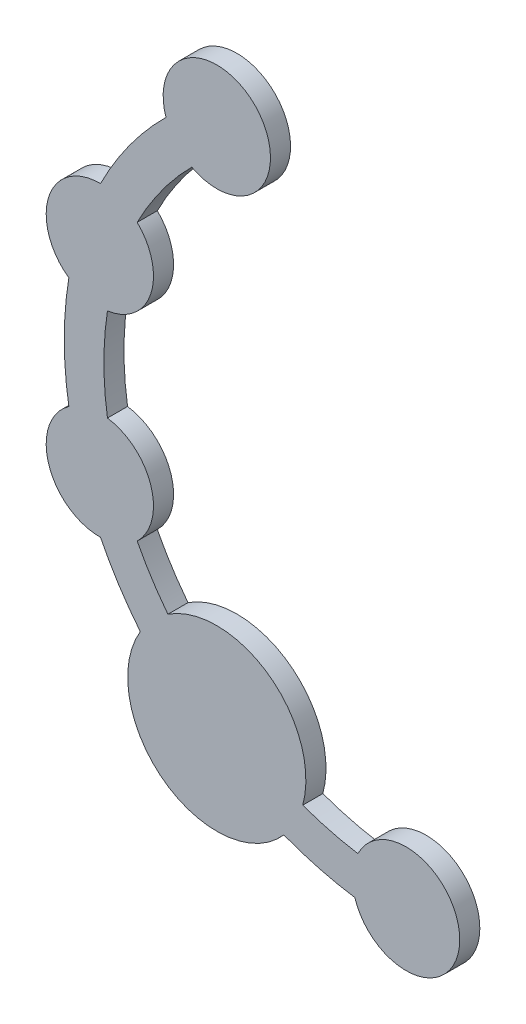
ISO-10303-21;
HEADER;
FILE_DESCRIPTION(('STEP AP214'),'2;1');
FILE_NAME('part.step','',(''),(''),'','','');
FILE_SCHEMA(('AUTOMOTIVE_DESIGN { 1 0 10303 214 1 1 1 1 }'));
ENDSEC;
DATA;
#1=APPLICATION_CONTEXT('core data for automotive mechanical design processes');
#2=APPLICATION_PROTOCOL_DEFINITION('international standard','automotive_design',2000,#1);
#3=PRODUCT_CONTEXT('',#1,'mechanical');
#4=PRODUCT('Part','Part','',(#3));
#5=PRODUCT_RELATED_PRODUCT_CATEGORY('part','',(#4));
#6=PRODUCT_DEFINITION_FORMATION('','',#4);
#7=PRODUCT_DEFINITION_CONTEXT('part definition',#1,'design');
#8=PRODUCT_DEFINITION('design','',#6,#7);
#9=PRODUCT_DEFINITION_SHAPE('','',#8);
#10=(LENGTH_UNIT() NAMED_UNIT(*) SI_UNIT(.MILLI.,.METRE.));
#11=(NAMED_UNIT(*) PLANE_ANGLE_UNIT() SI_UNIT($,.RADIAN.));
#12=(NAMED_UNIT(*) SI_UNIT($,.STERADIAN.) SOLID_ANGLE_UNIT());
#13=UNCERTAINTY_MEASURE_WITH_UNIT(LENGTH_MEASURE(1.E-05),#10,'distance_accuracy_value','');
#14=(GEOMETRIC_REPRESENTATION_CONTEXT(3) GLOBAL_UNCERTAINTY_ASSIGNED_CONTEXT((#13)) GLOBAL_UNIT_ASSIGNED_CONTEXT((#10,
#11,#12)) REPRESENTATION_CONTEXT('',''));
#15=CARTESIAN_POINT('',(0.,0.,0.));
#16=DIRECTION('',(0.,0.,1.));
#17=DIRECTION('',(1.,0.,0.));
#18=AXIS2_PLACEMENT_3D('',#15,#16,#17);
#19=CARTESIAN_POINT('',(0.,0.,0.));
#20=DIRECTION('',(0.,0.,1.));
#21=DIRECTION('',(1.,0.,0.));
#22=AXIS2_PLACEMENT_3D('',#19,#20,#21);
#23=CYLINDRICAL_SURFACE('',#22,30.5299999999999);
#24=CARTESIAN_POINT('',(0.,0.,0.));
#25=DIRECTION('',(0.,0.,-1.));
#26=DIRECTION('',(-1.,0.,0.));
#27=AXIS2_PLACEMENT_3D('',#24,#25,#26);
#28=CIRCLE('',#27,30.5299999999999);
#29=CARTESIAN_POINT('',(-27.1615635298566,13.9402427028211,0.));
#30=VERTEX_POINT('',#29);
#31=CARTESIAN_POINT('',(-21.6513433857743,21.5244100869521,0.));
#32=VERTEX_POINT('',#31);
#33=EDGE_CURVE('E312',#30,#32,#28,.T.);
#34=ORIENTED_EDGE('',*,*,#33,.T.);
#35=DIRECTION('',(0.,0.,-1.));
#36=VECTOR('',#35,1.);
#37=CARTESIAN_POINT('',(-21.6513433857743,21.5244100869521,1.015));
#38=LINE('',#37,#36);
#39=CARTESIAN_POINT('',(-21.6513433857743,21.5244100869521,2.03));
#40=VERTEX_POINT('',#39);
#41=EDGE_CURVE('E49',#32,#40,#38,.F.);
#42=ORIENTED_EDGE('',*,*,#41,.T.);
#43=CARTESIAN_POINT('',(0.,0.,2.03));
#44=DIRECTION('',(0.,0.,-1.));
#45=DIRECTION('',(-1.,0.,0.));
#46=AXIS2_PLACEMENT_3D('',#43,#44,#45);
#47=CIRCLE('',#46,30.5299999999999);
#48=CARTESIAN_POINT('',(-27.1615635298566,13.9402427028211,2.03));
#49=VERTEX_POINT('',#48);
#50=EDGE_CURVE('E174',#49,#40,#47,.T.);
#51=ORIENTED_EDGE('',*,*,#50,.F.);
#52=DIRECTION('',(0.,0.,-1.));
#53=VECTOR('',#52,1.);
#54=CARTESIAN_POINT('',(-27.1615635298566,13.9402427028211,1.015));
#55=LINE('',#54,#53);
#56=EDGE_CURVE('E247',#49,#30,#55,.T.);
#57=ORIENTED_EDGE('',*,*,#56,.T.);
#58=EDGE_LOOP('',(#34,#42,#51,#57));
#59=FACE_BOUND('',#58,.T.);
#60=ADVANCED_FACE('F34',(#59),#23,.F.);
#61=CARTESIAN_POINT('',(0.,0.,0.));
#62=DIRECTION('',(0.,0.,1.));
#63=DIRECTION('',(1.,0.,0.));
#64=AXIS2_PLACEMENT_3D('',#61,#62,#63);
#65=CYLINDRICAL_SURFACE('',#64,34.5300000000001);
#66=CARTESIAN_POINT('',(0.,0.,2.03));
#67=DIRECTION('',(0.,0.,1.));
#68=DIRECTION('',(-1.,0.,0.));
#69=AXIS2_PLACEMENT_3D('',#66,#67,#68);
#70=CIRCLE('',#69,34.5300000000001);
#71=CARTESIAN_POINT('',(-24.2539232103897,24.5777970718396,2.03));
#72=VERTEX_POINT('',#71);
#73=CARTESIAN_POINT('',(-30.8697485136282,15.4718947354664,2.03));
#74=VERTEX_POINT('',#73);
#75=EDGE_CURVE('E57',#72,#74,#70,.T.);
#76=ORIENTED_EDGE('',*,*,#75,.F.);
#77=DIRECTION('',(0.,0.,-1.));
#78=VECTOR('',#77,1.);
#79=CARTESIAN_POINT('',(-24.2539232103896,24.5777970718396,1.015));
#80=LINE('',#79,#78);
#81=CARTESIAN_POINT('',(-24.2539232103897,24.5777970718396,0.));
#82=VERTEX_POINT('',#81);
#83=EDGE_CURVE('E230',#72,#82,#80,.T.);
#84=ORIENTED_EDGE('',*,*,#83,.T.);
#85=CARTESIAN_POINT('',(0.,0.,0.));
#86=DIRECTION('',(0.,0.,1.));
#87=DIRECTION('',(-1.,0.,0.));
#88=AXIS2_PLACEMENT_3D('',#85,#86,#87);
#89=CIRCLE('',#88,34.5300000000001);
#90=CARTESIAN_POINT('',(-30.8697485136282,15.4718947354664,0.));
#91=VERTEX_POINT('',#90);
#92=EDGE_CURVE('E194',#82,#91,#89,.T.);
#93=ORIENTED_EDGE('',*,*,#92,.T.);
#94=DIRECTION('',(0.,0.,-1.));
#95=VECTOR('',#94,1.);
#96=CARTESIAN_POINT('',(-30.8697485136282,15.4718947354664,1.015));
#97=LINE('',#96,#95);
#98=EDGE_CURVE('E242',#91,#74,#97,.F.);
#99=ORIENTED_EDGE('',*,*,#98,.T.);
#100=EDGE_LOOP('',(#76,#84,#93,#99));
#101=FACE_BOUND('',#100,.T.);
#102=ADVANCED_FACE('F282',(#101),#65,.T.);
#103=CARTESIAN_POINT('',(-30.1680355635448,-4.68727321976121,0.));
#104=VERTEX_POINT('',#103);
#105=CARTESIAN_POINT('',(-30.1680355635448,4.68727321976142,0.));
#106=VERTEX_POINT('',#105);
#107=EDGE_CURVE('E193',#104,#106,#28,.T.);
#108=ORIENTED_EDGE('',*,*,#107,.T.);
#109=DIRECTION('',(0.,0.,-1.));
#110=VECTOR('',#109,1.);
#111=CARTESIAN_POINT('',(-30.1680355635448,4.68727321976142,1.015));
#112=LINE('',#111,#110);
#113=CARTESIAN_POINT('',(-30.1680355635448,4.68727321976142,2.03));
#114=VERTEX_POINT('',#113);
#115=EDGE_CURVE('E250',#106,#114,#112,.F.);
#116=ORIENTED_EDGE('',*,*,#115,.T.);
#117=CARTESIAN_POINT('',(-30.1680355635448,-4.68727321976122,2.03));
#118=VERTEX_POINT('',#117);
#119=EDGE_CURVE('E172',#118,#114,#47,.T.);
#120=ORIENTED_EDGE('',*,*,#119,.F.);
#121=DIRECTION('',(0.,0.,-1.));
#122=VECTOR('',#121,1.);
#123=CARTESIAN_POINT('',(-30.1680355635448,-4.68727321976121,1.015));
#124=LINE('',#123,#122);
#125=EDGE_CURVE('E182',#118,#104,#124,.T.);
#126=ORIENTED_EDGE('',*,*,#125,.T.);
#127=EDGE_LOOP('',(#108,#116,#120,#126));
#128=FACE_BOUND('',#127,.T.);
#129=ADVANCED_FACE('F284',(#128),#23,.F.);
#130=CARTESIAN_POINT('',(-34.0683027101347,5.62775714211587,2.03));
#131=VERTEX_POINT('',#130);
#132=CARTESIAN_POINT('',(-34.0683027101347,-5.62775714211564,2.03));
#133=VERTEX_POINT('',#132);
#134=EDGE_CURVE('E267',#131,#133,#70,.T.);
#135=ORIENTED_EDGE('',*,*,#134,.F.);
#136=DIRECTION('',(0.,0.,-1.));
#137=VECTOR('',#136,1.);
#138=CARTESIAN_POINT('',(-34.0683027101347,5.6277571421159,1.015));
#139=LINE('',#138,#137);
#140=CARTESIAN_POINT('',(-34.0683027101347,5.6277571421159,0.));
#141=VERTEX_POINT('',#140);
#142=EDGE_CURVE('E244',#131,#141,#139,.T.);
#143=ORIENTED_EDGE('',*,*,#142,.T.);
#144=CARTESIAN_POINT('',(-34.0683027101347,-5.62775714211564,0.));
#145=VERTEX_POINT('',#144);
#146=EDGE_CURVE('E196',#141,#145,#89,.T.);
#147=ORIENTED_EDGE('',*,*,#146,.T.);
#148=DIRECTION('',(0.,0.,-1.));
#149=VECTOR('',#148,1.);
#150=CARTESIAN_POINT('',(-34.0683027101347,-5.62775714211566,1.015));
#151=LINE('',#150,#149);
#152=EDGE_CURVE('E258',#145,#133,#151,.F.);
#153=ORIENTED_EDGE('',*,*,#152,.T.);
#154=EDGE_LOOP('',(#135,#143,#147,#153));
#155=FACE_BOUND('',#154,.T.);
#156=ADVANCED_FACE('F289',(#155),#65,.T.);
#157=DIRECTION('',(0.,0.,1.));
#158=VECTOR('',#157,1.);
#159=CARTESIAN_POINT('',(-24.0598496131678,-18.7937366319672,1.015));
#160=LINE('',#159,#158);
#161=CARTESIAN_POINT('',(-24.0598496131678,-18.7937366319672,0.));
#162=VERTEX_POINT('',#161);
#163=CARTESIAN_POINT('',(-24.0598496131678,-18.7937366319672,2.03));
#164=VERTEX_POINT('',#163);
#165=EDGE_CURVE('E146',#162,#164,#160,.T.);
#166=ORIENTED_EDGE('',*,*,#165,.F.);
#167=CARTESIAN_POINT('',(-27.1615635298567,-13.940242702821,0.));
#168=VERTEX_POINT('',#167);
#169=EDGE_CURVE('E192',#162,#168,#28,.T.);
#170=ORIENTED_EDGE('',*,*,#169,.T.);
#171=DIRECTION('',(0.,0.,-1.));
#172=VECTOR('',#171,1.);
#173=CARTESIAN_POINT('',(-27.1615635298567,-13.940242702821,1.015));
#174=LINE('',#173,#172);
#175=CARTESIAN_POINT('',(-27.1615635298567,-13.940242702821,2.03));
#176=VERTEX_POINT('',#175);
#177=EDGE_CURVE('E170',#168,#176,#174,.F.);
#178=ORIENTED_EDGE('',*,*,#177,.T.);
#179=EDGE_CURVE('E163',#164,#176,#47,.T.);
#180=ORIENTED_EDGE('',*,*,#179,.F.);
#181=EDGE_LOOP('',(#166,#170,#178,#180));
#182=FACE_BOUND('',#181,.T.);
#183=ADVANCED_FACE('F168',(#182),#23,.F.);
#184=DIRECTION('',(0.,0.,1.));
#185=VECTOR('',#184,1.);
#186=CARTESIAN_POINT('',(-26.8516963384864,-21.7096131643501,1.015));
#187=LINE('',#186,#185);
#188=CARTESIAN_POINT('',(-26.8516963384864,-21.7096131643501,2.03));
#189=VERTEX_POINT('',#188);
#190=CARTESIAN_POINT('',(-26.8516963384864,-21.7096131643501,0.));
#191=VERTEX_POINT('',#190);
#192=EDGE_CURVE('E157',#189,#191,#187,.F.);
#193=ORIENTED_EDGE('',*,*,#192,.F.);
#194=CARTESIAN_POINT('',(-30.8697485136284,-15.4718947354662,2.03));
#195=VERTEX_POINT('',#194);
#196=EDGE_CURVE('E265',#195,#189,#70,.T.);
#197=ORIENTED_EDGE('',*,*,#196,.F.);
#198=DIRECTION('',(0.,0.,-1.));
#199=VECTOR('',#198,1.);
#200=CARTESIAN_POINT('',(-30.8697485136284,-15.4718947354661,1.015));
#201=LINE('',#200,#199);
#202=CARTESIAN_POINT('',(-30.8697485136284,-15.4718947354661,0.));
#203=VERTEX_POINT('',#202);
#204=EDGE_CURVE('E185',#195,#203,#201,.T.);
#205=ORIENTED_EDGE('',*,*,#204,.T.);
#206=EDGE_CURVE('E197',#203,#191,#89,.T.);
#207=ORIENTED_EDGE('',*,*,#206,.T.);
#208=EDGE_LOOP('',(#193,#197,#205,#207));
#209=FACE_BOUND('',#208,.T.);
#210=ADVANCED_FACE('F207',(#209),#65,.T.);
#211=DIRECTION('',(0.,0.,1.));
#212=VECTOR('',#211,1.);
#213=CARTESIAN_POINT('',(-10.4390032767931,-28.6898607627695,1.015));
#214=LINE('',#213,#212);
#215=CARTESIAN_POINT('',(-10.4390032767931,-28.6898607627695,2.03));
#216=VERTEX_POINT('',#215);
#217=CARTESIAN_POINT('',(-10.4390032767931,-28.6898607627695,0.));
#218=VERTEX_POINT('',#217);
#219=EDGE_CURVE('E223',#216,#218,#214,.F.);
#220=ORIENTED_EDGE('',*,*,#219,.F.);
#221=CARTESIAN_POINT('',(-4.86457393673341,-30.1399538887181,2.03));
#222=VERTEX_POINT('',#221);
#223=EDGE_CURVE('E165',#222,#216,#47,.T.);
#224=ORIENTED_EDGE('',*,*,#223,.F.);
#225=DIRECTION('',(0.,0.,1.));
#226=VECTOR('',#225,1.);
#227=CARTESIAN_POINT('',(-4.86457393673341,-30.1399538887181,1.015));
#228=LINE('',#227,#226);
#229=CARTESIAN_POINT('',(-4.86457393673341,-30.1399538887181,0.));
#230=VERTEX_POINT('',#229);
#231=EDGE_CURVE('E201',#230,#222,#228,.T.);
#232=ORIENTED_EDGE('',*,*,#231,.F.);
#233=EDGE_CURVE('E189',#230,#218,#28,.T.);
#234=ORIENTED_EDGE('',*,*,#233,.T.);
#235=EDGE_LOOP('',(#220,#224,#232,#234));
#236=FACE_BOUND('',#235,.T.);
#237=ADVANCED_FACE('F285',(#236),#23,.F.);
#238=DIRECTION('',(0.,0.,1.));
#239=VECTOR('',#238,1.);
#240=CARTESIAN_POINT('',(-12.3494385698145,-32.2461201853864,1.015));
#241=LINE('',#240,#239);
#242=CARTESIAN_POINT('',(-12.3494385698145,-32.2461201853864,0.));
#243=VERTEX_POINT('',#242);
#244=CARTESIAN_POINT('',(-12.3494385698145,-32.2461201853864,2.03));
#245=VERTEX_POINT('',#244);
#246=EDGE_CURVE('E221',#243,#245,#241,.T.);
#247=ORIENTED_EDGE('',*,*,#246,.F.);
#248=CARTESIAN_POINT('',(-5.17536940480592,-34.1399538887182,0.));
#249=VERTEX_POINT('',#248);
#250=EDGE_CURVE('E191',#243,#249,#89,.T.);
#251=ORIENTED_EDGE('',*,*,#250,.T.);
#252=DIRECTION('',(0.,0.,1.));
#253=VECTOR('',#252,1.);
#254=CARTESIAN_POINT('',(-5.17536940480592,-34.1399538887182,1.015));
#255=LINE('',#254,#253);
#256=CARTESIAN_POINT('',(-5.17536940480592,-34.1399538887182,2.03));
#257=VERTEX_POINT('',#256);
#258=EDGE_CURVE('E195',#257,#249,#255,.F.);
#259=ORIENTED_EDGE('',*,*,#258,.F.);
#260=EDGE_CURVE('E175',#245,#257,#70,.T.);
#261=ORIENTED_EDGE('',*,*,#260,.F.);
#262=EDGE_LOOP('',(#247,#251,#259,#261));
#263=FACE_BOUND('',#262,.T.);
#264=ADVANCED_FACE('F290',(#263),#65,.T.);
#265=CARTESIAN_POINT('',(0.,-32.53,2.03));
#266=DIRECTION('',(0.,0.,-1.));
#267=DIRECTION('',(-1.,0.,0.));
#268=AXIS2_PLACEMENT_3D('',#265,#266,#267);
#269=CYLINDRICAL_SURFACE('',#268,5.42);
#270=CARTESIAN_POINT('',(0.,-32.53,0.));
#271=DIRECTION('',(0.,0.,1.));
#272=DIRECTION('',(1.,0.,0.));
#273=AXIS2_PLACEMENT_3D('',#270,#271,#272);
#274=CIRCLE('',#273,5.42);
#275=EDGE_CURVE('E38',#249,#230,#274,.T.);
#276=ORIENTED_EDGE('',*,*,#275,.T.);
#277=ORIENTED_EDGE('',*,*,#231,.T.);
#278=CARTESIAN_POINT('',(0.,-32.53,2.03));
#279=DIRECTION('',(0.,0.,1.));
#280=DIRECTION('',(1.,0.,0.));
#281=AXIS2_PLACEMENT_3D('',#278,#279,#280);
#282=CIRCLE('',#281,5.42);
#283=EDGE_CURVE('E11',#257,#222,#282,.T.);
#284=ORIENTED_EDGE('',*,*,#283,.F.);
#285=ORIENTED_EDGE('',*,*,#258,.T.);
#286=EDGE_LOOP('',(#276,#277,#284,#285));
#287=FACE_BOUND('',#286,.T.);
#288=ADVANCED_FACE('F36',(#287),#269,.T.);
#289=CARTESIAN_POINT('',(0.,-32.53,2.03));
#290=DIRECTION('',(0.,0.,1.));
#291=DIRECTION('',(1.,0.,0.));
#292=AXIS2_PLACEMENT_3D('',#289,#290,#291);
#293=PLANE('',#292);
#294=CARTESIAN_POINT('',(-19.1206542570742,-26.317322827017,2.03));
#295=DIRECTION('',(0.,0.,1.));
#296=DIRECTION('',(1.,0.,0.));
#297=AXIS2_PLACEMENT_3D('',#294,#295,#296);
#298=CIRCLE('',#297,9.);
#299=EDGE_CURVE('E149',#216,#164,#298,.T.);
#300=ORIENTED_EDGE('',*,*,#299,.T.);
#301=ORIENTED_EDGE('',*,*,#179,.T.);
#302=CARTESIAN_POINT('',(-30.9378684750814,-10.052322827017,2.03));
#303=DIRECTION('',(0.,0.,1.));
#304=DIRECTION('',(1.,0.,0.));
#305=AXIS2_PLACEMENT_3D('',#302,#303,#304);
#306=CIRCLE('',#305,5.41999999999999);
#307=EDGE_CURVE('E253',#176,#118,#306,.T.);
#308=ORIENTED_EDGE('',*,*,#307,.T.);
#309=ORIENTED_EDGE('',*,*,#119,.T.);
#310=CARTESIAN_POINT('',(-30.9378684750813,10.0523228270172,2.03));
#311=DIRECTION('',(0.,0.,1.));
#312=DIRECTION('',(1.,0.,0.));
#313=AXIS2_PLACEMENT_3D('',#310,#311,#312);
#314=CIRCLE('',#313,5.41999999999999);
#315=EDGE_CURVE('E236',#114,#49,#314,.T.);
#316=ORIENTED_EDGE('',*,*,#315,.T.);
#317=ORIENTED_EDGE('',*,*,#50,.T.);
#318=CARTESIAN_POINT('',(-19.120654257074,26.3173228270172,2.03));
#319=DIRECTION('',(0.,0.,1.));
#320=DIRECTION('',(1.,0.,0.));
#321=AXIS2_PLACEMENT_3D('',#318,#319,#320);
#322=CIRCLE('',#321,5.41999999999999);
#323=EDGE_CURVE('E228',#40,#72,#322,.T.);
#324=ORIENTED_EDGE('',*,*,#323,.T.);
#325=ORIENTED_EDGE('',*,*,#75,.T.);
#326=EDGE_CURVE('E238',#74,#131,#314,.T.);
#327=ORIENTED_EDGE('',*,*,#326,.T.);
#328=ORIENTED_EDGE('',*,*,#134,.T.);
#329=EDGE_CURVE('E255',#133,#195,#306,.T.);
#330=ORIENTED_EDGE('',*,*,#329,.T.);
#331=ORIENTED_EDGE('',*,*,#196,.T.);
#332=EDGE_CURVE('E166',#189,#245,#298,.T.);
#333=ORIENTED_EDGE('',*,*,#332,.T.);
#334=ORIENTED_EDGE('',*,*,#260,.T.);
#335=ORIENTED_EDGE('',*,*,#283,.T.);
#336=ORIENTED_EDGE('',*,*,#223,.T.);
#337=EDGE_LOOP('',(#300,#301,#308,#309,#316,#317,#324,#325,#327,#328,#330,#331,#333,#334,#335,#336));
#338=FACE_BOUND('',#337,.T.);
#339=ADVANCED_FACE('F161',(#338),#293,.T.);
#340=CARTESIAN_POINT('',(0.,-32.53,0.));
#341=DIRECTION('',(0.,0.,1.));
#342=DIRECTION('',(1.,0.,0.));
#343=AXIS2_PLACEMENT_3D('',#340,#341,#342);
#344=PLANE('',#343);
#345=ORIENTED_EDGE('',*,*,#169,.F.);
#346=CARTESIAN_POINT('',(-19.1206542570742,-26.317322827017,0.));
#347=DIRECTION('',(0.,0.,1.));
#348=DIRECTION('',(1.,0.,0.));
#349=AXIS2_PLACEMENT_3D('',#346,#347,#348);
#350=CIRCLE('',#349,9.);
#351=EDGE_CURVE('E152',#218,#162,#350,.T.);
#352=ORIENTED_EDGE('',*,*,#351,.F.);
#353=ORIENTED_EDGE('',*,*,#233,.F.);
#354=ORIENTED_EDGE('',*,*,#275,.F.);
#355=ORIENTED_EDGE('',*,*,#250,.F.);
#356=EDGE_CURVE('E217',#191,#243,#350,.T.);
#357=ORIENTED_EDGE('',*,*,#356,.F.);
#358=ORIENTED_EDGE('',*,*,#206,.F.);
#359=CARTESIAN_POINT('',(-30.9378684750814,-10.052322827017,0.));
#360=DIRECTION('',(0.,0.,1.));
#361=DIRECTION('',(1.,0.,0.));
#362=AXIS2_PLACEMENT_3D('',#359,#360,#361);
#363=CIRCLE('',#362,5.41999999999999);
#364=EDGE_CURVE('E215',#145,#203,#363,.T.);
#365=ORIENTED_EDGE('',*,*,#364,.F.);
#366=ORIENTED_EDGE('',*,*,#146,.F.);
#367=CARTESIAN_POINT('',(-30.9378684750813,10.0523228270172,0.));
#368=DIRECTION('',(0.,0.,1.));
#369=DIRECTION('',(1.,0.,0.));
#370=AXIS2_PLACEMENT_3D('',#367,#368,#369);
#371=CIRCLE('',#370,5.41999999999999);
#372=EDGE_CURVE('E239',#91,#141,#371,.T.);
#373=ORIENTED_EDGE('',*,*,#372,.F.);
#374=ORIENTED_EDGE('',*,*,#92,.F.);
#375=CARTESIAN_POINT('',(-19.120654257074,26.3173228270172,0.));
#376=DIRECTION('',(0.,0.,1.));
#377=DIRECTION('',(1.,0.,0.));
#378=AXIS2_PLACEMENT_3D('',#375,#376,#377);
#379=CIRCLE('',#378,5.41999999999999);
#380=EDGE_CURVE('E156',#32,#82,#379,.T.);
#381=ORIENTED_EDGE('',*,*,#380,.F.);
#382=ORIENTED_EDGE('',*,*,#33,.F.);
#383=EDGE_CURVE('E235',#106,#30,#371,.T.);
#384=ORIENTED_EDGE('',*,*,#383,.F.);
#385=ORIENTED_EDGE('',*,*,#107,.F.);
#386=EDGE_CURVE('E252',#168,#104,#363,.T.);
#387=ORIENTED_EDGE('',*,*,#386,.F.);
#388=EDGE_LOOP('',(#345,#352,#353,#354,#355,#357,#358,#365,#366,#373,#374,#381,#382,#384,#385,#387));
#389=FACE_BOUND('',#388,.T.);
#390=ADVANCED_FACE('F214',(#389),#344,.F.);
#391=CARTESIAN_POINT('',(-30.9378684750814,-10.052322827017,2.03));
#392=DIRECTION('',(0.,0.,-1.));
#393=DIRECTION('',(-1.,0.,0.));
#394=AXIS2_PLACEMENT_3D('',#391,#392,#393);
#395=CYLINDRICAL_SURFACE('',#394,5.41999999999999);
#396=ORIENTED_EDGE('',*,*,#204,.F.);
#397=ORIENTED_EDGE('',*,*,#329,.F.);
#398=ORIENTED_EDGE('',*,*,#152,.F.);
#399=ORIENTED_EDGE('',*,*,#364,.T.);
#400=EDGE_LOOP('',(#396,#397,#398,#399));
#401=FACE_BOUND('',#400,.T.);
#402=ADVANCED_FACE('F269',(#401),#395,.T.);
#403=ORIENTED_EDGE('',*,*,#177,.F.);
#404=ORIENTED_EDGE('',*,*,#386,.T.);
#405=ORIENTED_EDGE('',*,*,#125,.F.);
#406=ORIENTED_EDGE('',*,*,#307,.F.);
#407=EDGE_LOOP('',(#403,#404,#405,#406));
#408=FACE_BOUND('',#407,.T.);
#409=ADVANCED_FACE('F271',(#408),#395,.T.);
#410=CARTESIAN_POINT('',(-30.9378684750813,10.0523228270172,2.03));
#411=DIRECTION('',(0.,0.,-1.));
#412=DIRECTION('',(-1.,0.,0.));
#413=AXIS2_PLACEMENT_3D('',#410,#411,#412);
#414=CYLINDRICAL_SURFACE('',#413,5.41999999999999);
#415=ORIENTED_EDGE('',*,*,#142,.F.);
#416=ORIENTED_EDGE('',*,*,#326,.F.);
#417=ORIENTED_EDGE('',*,*,#98,.F.);
#418=ORIENTED_EDGE('',*,*,#372,.T.);
#419=EDGE_LOOP('',(#415,#416,#417,#418));
#420=FACE_BOUND('',#419,.T.);
#421=ADVANCED_FACE('F277',(#420),#414,.T.);
#422=ORIENTED_EDGE('',*,*,#115,.F.);
#423=ORIENTED_EDGE('',*,*,#383,.T.);
#424=ORIENTED_EDGE('',*,*,#56,.F.);
#425=ORIENTED_EDGE('',*,*,#315,.F.);
#426=EDGE_LOOP('',(#422,#423,#424,#425));
#427=FACE_BOUND('',#426,.T.);
#428=ADVANCED_FACE('F317',(#427),#414,.T.);
#429=CARTESIAN_POINT('',(-19.120654257074,26.3173228270172,2.03));
#430=DIRECTION('',(0.,0.,-1.));
#431=DIRECTION('',(-1.,0.,0.));
#432=AXIS2_PLACEMENT_3D('',#429,#430,#431);
#433=CYLINDRICAL_SURFACE('',#432,5.41999999999999);
#434=ORIENTED_EDGE('',*,*,#41,.F.);
#435=ORIENTED_EDGE('',*,*,#380,.T.);
#436=ORIENTED_EDGE('',*,*,#83,.F.);
#437=ORIENTED_EDGE('',*,*,#323,.F.);
#438=EDGE_LOOP('',(#434,#435,#436,#437));
#439=FACE_BOUND('',#438,.T.);
#440=ADVANCED_FACE('F315',(#439),#433,.T.);
#441=CARTESIAN_POINT('',(-19.1206542570742,-26.317322827017,0.));
#442=DIRECTION('',(0.,0.,1.));
#443=DIRECTION('',(1.,0.,0.));
#444=AXIS2_PLACEMENT_3D('',#441,#442,#443);
#445=CYLINDRICAL_SURFACE('',#444,9.);
#446=ORIENTED_EDGE('',*,*,#351,.T.);
#447=ORIENTED_EDGE('',*,*,#165,.T.);
#448=ORIENTED_EDGE('',*,*,#299,.F.);
#449=ORIENTED_EDGE('',*,*,#219,.T.);
#450=EDGE_LOOP('',(#446,#447,#448,#449));
#451=FACE_BOUND('',#450,.T.);
#452=ADVANCED_FACE('F148',(#451),#445,.T.);
#453=ORIENTED_EDGE('',*,*,#332,.F.);
#454=ORIENTED_EDGE('',*,*,#192,.T.);
#455=ORIENTED_EDGE('',*,*,#356,.T.);
#456=ORIENTED_EDGE('',*,*,#246,.T.);
#457=EDGE_LOOP('',(#453,#454,#455,#456));
#458=FACE_BOUND('',#457,.T.);
#459=ADVANCED_FACE('F323',(#458),#445,.T.);
#460=CLOSED_SHELL('',(#60,#102,#129,#156,#183,#210,#237,#264,#288,#339,#390,#402,#409,#421,#428,
#440,#452,#459));
#461=MANIFOLD_SOLID_BREP('B2',#460);
#462=ADVANCED_BREP_SHAPE_REPRESENTATION('',(#18,#461),#14);
#463=SHAPE_DEFINITION_REPRESENTATION(#9,#462);
ENDSEC;
END-ISO-10303-21;
